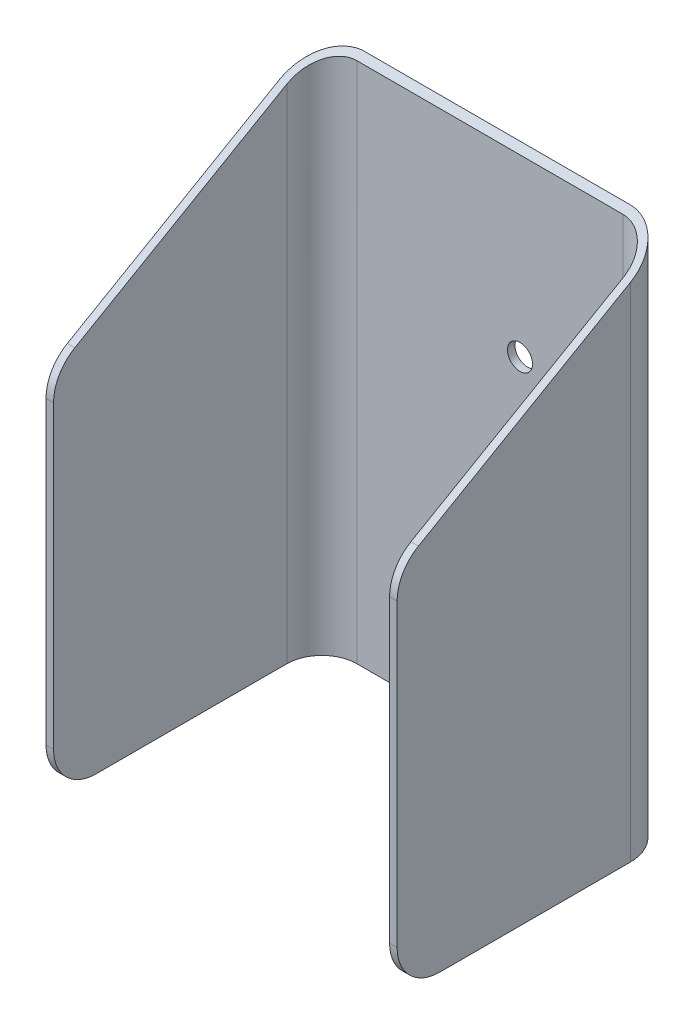
ISO-10303-21;
HEADER;
FILE_DESCRIPTION(('STEP AP214'),'2;1');
FILE_NAME('part.step','',(''),(''),'','','');
FILE_SCHEMA(('AUTOMOTIVE_DESIGN { 1 0 10303 214 1 1 1 1 }'));
ENDSEC;
DATA;
#1=APPLICATION_CONTEXT('core data for automotive mechanical design processes');
#2=APPLICATION_PROTOCOL_DEFINITION('international standard','automotive_design',2000,#1);
#3=PRODUCT_CONTEXT('',#1,'mechanical');
#4=PRODUCT('Part','Part','',(#3));
#5=PRODUCT_RELATED_PRODUCT_CATEGORY('part','',(#4));
#6=PRODUCT_DEFINITION_FORMATION('','',#4);
#7=PRODUCT_DEFINITION_CONTEXT('part definition',#1,'design');
#8=PRODUCT_DEFINITION('design','',#6,#7);
#9=PRODUCT_DEFINITION_SHAPE('','',#8);
#10=(LENGTH_UNIT() NAMED_UNIT(*) SI_UNIT(.MILLI.,.METRE.));
#11=(NAMED_UNIT(*) PLANE_ANGLE_UNIT() SI_UNIT($,.RADIAN.));
#12=(NAMED_UNIT(*) SI_UNIT($,.STERADIAN.) SOLID_ANGLE_UNIT());
#13=UNCERTAINTY_MEASURE_WITH_UNIT(LENGTH_MEASURE(1.E-05),#10,'distance_accuracy_value','');
#14=(GEOMETRIC_REPRESENTATION_CONTEXT(3) GLOBAL_UNCERTAINTY_ASSIGNED_CONTEXT((#13)) GLOBAL_UNIT_ASSIGNED_CONTEXT((#10,
#11,#12)) REPRESENTATION_CONTEXT('',''));
#15=CARTESIAN_POINT('',(0.,0.,0.));
#16=DIRECTION('',(0.,0.,1.));
#17=DIRECTION('',(1.,0.,0.));
#18=AXIS2_PLACEMENT_3D('',#15,#16,#17);
#19=CARTESIAN_POINT('',(1.5,0.,0.));
#20=DIRECTION('',(1.,0.,0.));
#21=DIRECTION('',(0.,0.,-1.));
#22=AXIS2_PLACEMENT_3D('',#19,#20,#21);
#23=PLANE('',#22);
#24=DIRECTION('',(0.,1.,0.));
#25=VECTOR('',#24,1.);
#26=CARTESIAN_POINT('',(1.5,0.,8.5));
#27=LINE('',#26,#25);
#28=CARTESIAN_POINT('',(1.5,100.092522711888,8.5));
#29=VERTEX_POINT('',#28);
#30=CARTESIAN_POINT('',(1.5,0.,8.5));
#31=VERTEX_POINT('',#30);
#32=EDGE_CURVE('E232',#29,#31,#27,.F.);
#33=ORIENTED_EDGE('',*,*,#32,.F.);
#34=DIRECTION('',(0.,0.500000000000004,-0.866025403784436));
#35=VECTOR('',#34,1.);
#36=CARTESIAN_POINT('',(1.5,105.,0.));
#37=LINE('',#36,#35);
#38=CARTESIAN_POINT('',(1.5,75.6994738386261,50.75));
#39=VERTEX_POINT('',#38);
#40=EDGE_CURVE('E254',#39,#29,#37,.T.);
#41=ORIENTED_EDGE('',*,*,#40,.F.);
#42=CARTESIAN_POINT('',(1.5,68.3382579064584,46.5));
#43=DIRECTION('',(-1.,0.,0.));
#44=DIRECTION('',(0.,0.,1.));
#45=AXIS2_PLACEMENT_3D('',#42,#43,#44);
#46=CIRCLE('',#45,8.5);
#47=CARTESIAN_POINT('',(1.5,68.3382579064584,55.));
#48=VERTEX_POINT('',#47);
#49=EDGE_CURVE('E11',#39,#48,#46,.F.);
#50=ORIENTED_EDGE('',*,*,#49,.T.);
#51=DIRECTION('',(0.,1.,0.));
#52=VECTOR('',#51,1.);
#53=CARTESIAN_POINT('',(1.5,73.2457351945702,55.));
#54=LINE('',#53,#52);
#55=CARTESIAN_POINT('',(1.5,8.49999999999999,55.));
#56=VERTEX_POINT('',#55);
#57=EDGE_CURVE('E234',#56,#48,#54,.T.);
#58=ORIENTED_EDGE('',*,*,#57,.F.);
#59=CARTESIAN_POINT('',(1.5,8.5,46.5));
#60=DIRECTION('',(-1.,0.,0.));
#61=DIRECTION('',(0.,0.,1.));
#62=AXIS2_PLACEMENT_3D('',#59,#60,#61);
#63=CIRCLE('',#62,8.5);
#64=CARTESIAN_POINT('',(1.5,0.,46.5));
#65=VERTEX_POINT('',#64);
#66=EDGE_CURVE('E258',#56,#65,#63,.F.);
#67=ORIENTED_EDGE('',*,*,#66,.T.);
#68=DIRECTION('',(0.,0.,1.));
#69=VECTOR('',#68,1.);
#70=CARTESIAN_POINT('',(1.5,0.,55.));
#71=LINE('',#70,#69);
#72=EDGE_CURVE('E158',#31,#65,#71,.T.);
#73=ORIENTED_EDGE('',*,*,#72,.F.);
#74=EDGE_LOOP('',(#33,#41,#50,#58,#67,#73));
#75=FACE_BOUND('',#74,.T.);
#76=ADVANCED_FACE('F33',(#75),#23,.T.);
#77=CARTESIAN_POINT('',(8.5,0.,8.5));
#78=DIRECTION('',(0.,1.,0.));
#79=DIRECTION('',(0.,0.,1.));
#80=AXIS2_PLACEMENT_3D('',#77,#78,#79);
#81=CYLINDRICAL_SURFACE('',#80,7.);
#82=ORIENTED_EDGE('',*,*,#32,.T.);
#83=CARTESIAN_POINT('',(8.5,0.,8.5));
#84=DIRECTION('',(0.,1.,0.));
#85=DIRECTION('',(0.,0.,1.));
#86=AXIS2_PLACEMENT_3D('',#83,#84,#85);
#87=CIRCLE('',#86,7.);
#88=CARTESIAN_POINT('',(8.5,0.,1.5));
#89=VERTEX_POINT('',#88);
#90=EDGE_CURVE('E241',#89,#31,#87,.T.);
#91=ORIENTED_EDGE('',*,*,#90,.F.);
#92=DIRECTION('',(0.,1.,0.));
#93=VECTOR('',#92,1.);
#94=CARTESIAN_POINT('',(8.5,0.,1.5));
#95=LINE('',#94,#93);
#96=CARTESIAN_POINT('',(8.5,104.133974596216,1.5));
#97=VERTEX_POINT('',#96);
#98=EDGE_CURVE('E237',#89,#97,#95,.T.);
#99=ORIENTED_EDGE('',*,*,#98,.T.);
#100=CARTESIAN_POINT('',(8.5,100.092522711888,8.5));
#101=DIRECTION('',(0.,-0.866025403784436,-0.500000000000004));
#102=DIRECTION('',(0.,-0.500000000000004,0.866025403784436));
#103=AXIS2_PLACEMENT_3D('',#100,#101,#102);
#104=ELLIPSE('',#103,8.08290376865478,7.);
#105=EDGE_CURVE('E257',#29,#97,#104,.T.);
#106=ORIENTED_EDGE('',*,*,#105,.F.);
#107=EDGE_LOOP('',(#82,#91,#99,#106));
#108=FACE_BOUND('',#107,.T.);
#109=ADVANCED_FACE('F35',(#108),#81,.F.);
#110=CARTESIAN_POINT('',(70.,0.,1.5));
#111=DIRECTION('',(0.,0.,1.));
#112=DIRECTION('',(1.,0.,0.));
#113=AXIS2_PLACEMENT_3D('',#110,#111,#112);
#114=PLANE('',#113);
#115=CARTESIAN_POINT('',(41.,54.2360214657054,1.5));
#116=DIRECTION('',(0.,0.,1.));
#117=DIRECTION('',(1.,0.,0.));
#118=AXIS2_PLACEMENT_3D('',#115,#116,#117);
#119=CIRCLE('',#118,2.5);
#120=CARTESIAN_POINT('',(43.5,54.2360214657054,1.5));
#121=VERTEX_POINT('',#120);
#122=EDGE_CURVE('E297',#121,#121,#119,.F.);
#123=ORIENTED_EDGE('',*,*,#122,.T.);
#124=EDGE_LOOP('',(#123));
#125=FACE_BOUND('',#124,.T.);
#126=CARTESIAN_POINT('',(41.,69.2360214657054,1.5));
#127=DIRECTION('',(0.,0.,1.));
#128=DIRECTION('',(1.,0.,0.));
#129=AXIS2_PLACEMENT_3D('',#126,#127,#128);
#130=CIRCLE('',#129,2.50000000000001);
#131=CARTESIAN_POINT('',(43.5,69.2360214657054,1.5));
#132=VERTEX_POINT('',#131);
#133=EDGE_CURVE('E187',#132,#132,#130,.F.);
#134=ORIENTED_EDGE('',*,*,#133,.T.);
#135=EDGE_LOOP('',(#134));
#136=FACE_BOUND('',#135,.T.);
#137=DIRECTION('',(0.,1.,0.));
#138=VECTOR('',#137,1.);
#139=CARTESIAN_POINT('',(61.5,0.,1.5));
#140=LINE('',#139,#138);
#141=CARTESIAN_POINT('',(61.5,104.133974596216,1.5));
#142=VERTEX_POINT('',#141);
#143=CARTESIAN_POINT('',(61.5,0.,1.5));
#144=VERTEX_POINT('',#143);
#145=EDGE_CURVE('E231',#142,#144,#140,.F.);
#146=ORIENTED_EDGE('',*,*,#145,.F.);
#147=DIRECTION('',(1.,0.,0.));
#148=VECTOR('',#147,1.);
#149=CARTESIAN_POINT('',(70.,104.133974596216,1.5));
#150=LINE('',#149,#148);
#151=EDGE_CURVE('E262',#97,#142,#150,.T.);
#152=ORIENTED_EDGE('',*,*,#151,.F.);
#153=ORIENTED_EDGE('',*,*,#98,.F.);
#154=DIRECTION('',(-1.,0.,0.));
#155=VECTOR('',#154,1.);
#156=CARTESIAN_POINT('',(70.,0.,1.5));
#157=LINE('',#156,#155);
#158=EDGE_CURVE('E243',#144,#89,#157,.T.);
#159=ORIENTED_EDGE('',*,*,#158,.F.);
#160=EDGE_LOOP('',(#146,#152,#153,#159));
#161=FACE_BOUND('',#160,.T.);
#162=ADVANCED_FACE('F328',(#125,#136,#161),#114,.T.);
#163=CARTESIAN_POINT('',(61.5,0.,8.5));
#164=DIRECTION('',(0.,-1.,0.));
#165=DIRECTION('',(0.,0.,-1.));
#166=AXIS2_PLACEMENT_3D('',#163,#164,#165);
#167=CYLINDRICAL_SURFACE('',#166,7.);
#168=ORIENTED_EDGE('',*,*,#145,.T.);
#169=CARTESIAN_POINT('',(61.5,0.,8.5));
#170=DIRECTION('',(0.,1.,0.));
#171=DIRECTION('',(0.,0.,1.));
#172=AXIS2_PLACEMENT_3D('',#169,#170,#171);
#173=CIRCLE('',#172,7.);
#174=CARTESIAN_POINT('',(68.5,0.,8.5));
#175=VERTEX_POINT('',#174);
#176=EDGE_CURVE('E246',#175,#144,#173,.T.);
#177=ORIENTED_EDGE('',*,*,#176,.F.);
#178=DIRECTION('',(0.,1.,0.));
#179=VECTOR('',#178,1.);
#180=CARTESIAN_POINT('',(68.5,0.,8.5));
#181=LINE('',#180,#179);
#182=CARTESIAN_POINT('',(68.5,100.092522711888,8.5));
#183=VERTEX_POINT('',#182);
#184=EDGE_CURVE('E235',#175,#183,#181,.T.);
#185=ORIENTED_EDGE('',*,*,#184,.T.);
#186=CARTESIAN_POINT('',(61.5,100.092522711888,8.5));
#187=DIRECTION('',(0.,-0.866025403784436,-0.500000000000004));
#188=DIRECTION('',(0.,-0.500000000000004,0.866025403784436));
#189=AXIS2_PLACEMENT_3D('',#186,#187,#188);
#190=ELLIPSE('',#189,8.08290376865478,7.);
#191=EDGE_CURVE('E265',#142,#183,#190,.T.);
#192=ORIENTED_EDGE('',*,*,#191,.F.);
#193=EDGE_LOOP('',(#168,#177,#185,#192));
#194=FACE_BOUND('',#193,.T.);
#195=ADVANCED_FACE('F325',(#194),#167,.F.);
#196=CARTESIAN_POINT('',(68.5,0.,0.));
#197=DIRECTION('',(1.,0.,0.));
#198=DIRECTION('',(0.,0.,-1.));
#199=AXIS2_PLACEMENT_3D('',#196,#197,#198);
#200=PLANE('',#199);
#201=ORIENTED_EDGE('',*,*,#184,.F.);
#202=DIRECTION('',(0.,0.,-1.));
#203=VECTOR('',#202,1.);
#204=CARTESIAN_POINT('',(68.5,0.,55.));
#205=LINE('',#204,#203);
#206=CARTESIAN_POINT('',(68.5,0.,46.5));
#207=VERTEX_POINT('',#206);
#208=EDGE_CURVE('E249',#207,#175,#205,.T.);
#209=ORIENTED_EDGE('',*,*,#208,.F.);
#210=CARTESIAN_POINT('',(68.5,8.5,46.5));
#211=DIRECTION('',(1.,0.,0.));
#212=DIRECTION('',(0.,0.,-1.));
#213=AXIS2_PLACEMENT_3D('',#210,#211,#212);
#214=CIRCLE('',#213,8.5);
#215=CARTESIAN_POINT('',(68.5,8.49999999999999,55.));
#216=VERTEX_POINT('',#215);
#217=EDGE_CURVE('E37',#207,#216,#214,.F.);
#218=ORIENTED_EDGE('',*,*,#217,.T.);
#219=DIRECTION('',(0.,-1.,0.));
#220=VECTOR('',#219,1.);
#221=CARTESIAN_POINT('',(68.5,73.2457351945702,55.));
#222=LINE('',#221,#220);
#223=CARTESIAN_POINT('',(68.5,68.3382579064584,55.));
#224=VERTEX_POINT('',#223);
#225=EDGE_CURVE('E253',#224,#216,#222,.T.);
#226=ORIENTED_EDGE('',*,*,#225,.F.);
#227=CARTESIAN_POINT('',(68.5,68.3382579064584,46.5));
#228=DIRECTION('',(1.,0.,0.));
#229=DIRECTION('',(0.,0.,-1.));
#230=AXIS2_PLACEMENT_3D('',#227,#228,#229);
#231=CIRCLE('',#230,8.5);
#232=CARTESIAN_POINT('',(68.5,75.6994738386261,50.75));
#233=VERTEX_POINT('',#232);
#234=EDGE_CURVE('E42',#224,#233,#231,.F.);
#235=ORIENTED_EDGE('',*,*,#234,.T.);
#236=DIRECTION('',(0.,-0.500000000000004,0.866025403784436));
#237=VECTOR('',#236,1.);
#238=CARTESIAN_POINT('',(68.5,105.,0.));
#239=LINE('',#238,#237);
#240=EDGE_CURVE('E56',#183,#233,#239,.T.);
#241=ORIENTED_EDGE('',*,*,#240,.F.);
#242=EDGE_LOOP('',(#201,#209,#218,#226,#235,#241));
#243=FACE_BOUND('',#242,.T.);
#244=ADVANCED_FACE('F278',(#243),#200,.F.);
#245=CARTESIAN_POINT('',(70.,73.2457351945702,55.));
#246=DIRECTION('',(0.,0.,-1.));
#247=DIRECTION('',(0.,1.,0.));
#248=AXIS2_PLACEMENT_3D('',#245,#246,#247);
#249=PLANE('',#248);
#250=DIRECTION('',(-1.,0.,0.));
#251=VECTOR('',#250,1.);
#252=CARTESIAN_POINT('',(70.,68.3382579064584,55.));
#253=LINE('',#252,#251);
#254=CARTESIAN_POINT('',(70.,68.3382579064584,55.));
#255=VERTEX_POINT('',#254);
#256=EDGE_CURVE('E206',#255,#224,#253,.T.);
#257=ORIENTED_EDGE('',*,*,#256,.T.);
#258=ORIENTED_EDGE('',*,*,#225,.T.);
#259=DIRECTION('',(-1.,0.,0.));
#260=VECTOR('',#259,1.);
#261=CARTESIAN_POINT('',(70.,8.49999999999999,55.));
#262=LINE('',#261,#260);
#263=CARTESIAN_POINT('',(70.,8.49999999999999,55.));
#264=VERTEX_POINT('',#263);
#265=EDGE_CURVE('E209',#216,#264,#262,.F.);
#266=ORIENTED_EDGE('',*,*,#265,.T.);
#267=DIRECTION('',(0.,-1.,0.));
#268=VECTOR('',#267,1.);
#269=CARTESIAN_POINT('',(70.,73.2457351945702,55.));
#270=LINE('',#269,#268);
#271=EDGE_CURVE('E190',#255,#264,#270,.T.);
#272=ORIENTED_EDGE('',*,*,#271,.F.);
#273=EDGE_LOOP('',(#257,#258,#266,#272));
#274=FACE_BOUND('',#273,.T.);
#275=ADVANCED_FACE('F271',(#274),#249,.F.);
#276=CARTESIAN_POINT('',(70.,8.5,46.5));
#277=DIRECTION('',(-1.,0.,0.));
#278=DIRECTION('',(0.,0.,1.));
#279=AXIS2_PLACEMENT_3D('',#276,#277,#278);
#280=CYLINDRICAL_SURFACE('',#279,8.5);
#281=ORIENTED_EDGE('',*,*,#217,.F.);
#282=DIRECTION('',(-1.,0.,0.));
#283=VECTOR('',#282,1.);
#284=CARTESIAN_POINT('',(70.,0.,46.5));
#285=LINE('',#284,#283);
#286=CARTESIAN_POINT('',(70.,0.,46.5));
#287=VERTEX_POINT('',#286);
#288=EDGE_CURVE('E162',#287,#207,#285,.T.);
#289=ORIENTED_EDGE('',*,*,#288,.F.);
#290=CARTESIAN_POINT('',(70.,8.5,46.5));
#291=DIRECTION('',(1.,0.,0.));
#292=DIRECTION('',(0.,0.,-1.));
#293=AXIS2_PLACEMENT_3D('',#290,#291,#292);
#294=CIRCLE('',#293,8.5);
#295=EDGE_CURVE('E216',#264,#287,#294,.T.);
#296=ORIENTED_EDGE('',*,*,#295,.F.);
#297=ORIENTED_EDGE('',*,*,#265,.F.);
#298=EDGE_LOOP('',(#281,#289,#296,#297));
#299=FACE_BOUND('',#298,.T.);
#300=ADVANCED_FACE('F282',(#299),#280,.T.);
#301=CARTESIAN_POINT('',(70.,68.3382579064584,46.5));
#302=DIRECTION('',(-1.,0.,0.));
#303=DIRECTION('',(0.,0.,1.));
#304=AXIS2_PLACEMENT_3D('',#301,#302,#303);
#305=CYLINDRICAL_SURFACE('',#304,8.5);
#306=ORIENTED_EDGE('',*,*,#234,.F.);
#307=ORIENTED_EDGE('',*,*,#256,.F.);
#308=CARTESIAN_POINT('',(70.,68.3382579064584,46.5));
#309=DIRECTION('',(1.,0.,0.));
#310=DIRECTION('',(0.,0.,-1.));
#311=AXIS2_PLACEMENT_3D('',#308,#309,#310);
#312=CIRCLE('',#311,8.5);
#313=CARTESIAN_POINT('',(70.,75.6994738386261,50.75));
#314=VERTEX_POINT('',#313);
#315=EDGE_CURVE('E214',#314,#255,#312,.T.);
#316=ORIENTED_EDGE('',*,*,#315,.F.);
#317=DIRECTION('',(-1.,0.,0.));
#318=VECTOR('',#317,1.);
#319=CARTESIAN_POINT('',(70.,75.6994738386261,50.75));
#320=LINE('',#319,#318);
#321=EDGE_CURVE('E222',#233,#314,#320,.F.);
#322=ORIENTED_EDGE('',*,*,#321,.F.);
#323=EDGE_LOOP('',(#306,#307,#316,#322));
#324=FACE_BOUND('',#323,.T.);
#325=ADVANCED_FACE('F321',(#324),#305,.T.);
#326=CARTESIAN_POINT('',(70.,0.,55.));
#327=DIRECTION('',(0.,1.,0.));
#328=DIRECTION('',(0.,0.,1.));
#329=AXIS2_PLACEMENT_3D('',#326,#327,#328);
#330=PLANE('',#329);
#331=ORIENTED_EDGE('',*,*,#288,.T.);
#332=ORIENTED_EDGE('',*,*,#208,.T.);
#333=ORIENTED_EDGE('',*,*,#176,.T.);
#334=ORIENTED_EDGE('',*,*,#158,.T.);
#335=ORIENTED_EDGE('',*,*,#90,.T.);
#336=ORIENTED_EDGE('',*,*,#72,.T.);
#337=CARTESIAN_POINT('',(0.,0.,46.5));
#338=VERTEX_POINT('',#337);
#339=EDGE_CURVE('E149',#65,#338,#285,.T.);
#340=ORIENTED_EDGE('',*,*,#339,.T.);
#341=DIRECTION('',(0.,0.,-1.));
#342=VECTOR('',#341,1.);
#343=CARTESIAN_POINT('',(0.,0.,55.));
#344=LINE('',#343,#342);
#345=CARTESIAN_POINT('',(0.,0.,8.5));
#346=VERTEX_POINT('',#345);
#347=EDGE_CURVE('E154',#338,#346,#344,.T.);
#348=ORIENTED_EDGE('',*,*,#347,.T.);
#349=CARTESIAN_POINT('',(8.5,0.,8.5));
#350=DIRECTION('',(0.,1.,0.));
#351=DIRECTION('',(0.,0.,1.));
#352=AXIS2_PLACEMENT_3D('',#349,#350,#351);
#353=CIRCLE('',#352,8.5);
#354=CARTESIAN_POINT('',(8.5,0.,0.));
#355=VERTEX_POINT('',#354);
#356=EDGE_CURVE('E201',#346,#355,#353,.F.);
#357=ORIENTED_EDGE('',*,*,#356,.T.);
#358=DIRECTION('',(-1.,0.,0.));
#359=VECTOR('',#358,1.);
#360=CARTESIAN_POINT('',(70.,0.,0.));
#361=LINE('',#360,#359);
#362=CARTESIAN_POINT('',(61.5,0.,0.));
#363=VERTEX_POINT('',#362);
#364=EDGE_CURVE('E198',#363,#355,#361,.T.);
#365=ORIENTED_EDGE('',*,*,#364,.F.);
#366=CARTESIAN_POINT('',(61.5,0.,8.5));
#367=DIRECTION('',(0.,1.,0.));
#368=DIRECTION('',(0.,0.,1.));
#369=AXIS2_PLACEMENT_3D('',#366,#367,#368);
#370=CIRCLE('',#369,8.5);
#371=CARTESIAN_POINT('',(70.,0.,8.5));
#372=VERTEX_POINT('',#371);
#373=EDGE_CURVE('E163',#363,#372,#370,.F.);
#374=ORIENTED_EDGE('',*,*,#373,.T.);
#375=DIRECTION('',(0.,0.,-1.));
#376=VECTOR('',#375,1.);
#377=CARTESIAN_POINT('',(70.,0.,55.));
#378=LINE('',#377,#376);
#379=EDGE_CURVE('E194',#287,#372,#378,.T.);
#380=ORIENTED_EDGE('',*,*,#379,.F.);
#381=EDGE_LOOP('',(#331,#332,#333,#334,#335,#336,#340,#348,#357,#365,#374,#380));
#382=FACE_BOUND('',#381,.T.);
#383=ADVANCED_FACE('F152',(#382),#330,.F.);
#384=CARTESIAN_POINT('',(70.,0.,0.));
#385=DIRECTION('',(0.,0.,1.));
#386=DIRECTION('',(1.,0.,0.));
#387=AXIS2_PLACEMENT_3D('',#384,#385,#386);
#388=PLANE('',#387);
#389=CARTESIAN_POINT('',(41.,54.2360214657054,0.));
#390=DIRECTION('',(0.,0.,-1.));
#391=DIRECTION('',(-1.,0.,0.));
#392=AXIS2_PLACEMENT_3D('',#389,#390,#391);
#393=CIRCLE('',#392,2.5);
#394=CARTESIAN_POINT('',(38.5,54.2360214657054,0.));
#395=VERTEX_POINT('',#394);
#396=EDGE_CURVE('E295',#395,#395,#393,.T.);
#397=ORIENTED_EDGE('',*,*,#396,.F.);
#398=EDGE_LOOP('',(#397));
#399=FACE_BOUND('',#398,.T.);
#400=CARTESIAN_POINT('',(41.,69.2360214657054,0.));
#401=DIRECTION('',(0.,0.,-1.));
#402=DIRECTION('',(-1.,0.,0.));
#403=AXIS2_PLACEMENT_3D('',#400,#401,#402);
#404=CIRCLE('',#403,2.50000000000001);
#405=CARTESIAN_POINT('',(38.5,69.2360214657054,0.));
#406=VERTEX_POINT('',#405);
#407=EDGE_CURVE('E181',#406,#406,#404,.T.);
#408=ORIENTED_EDGE('',*,*,#407,.F.);
#409=EDGE_LOOP('',(#408));
#410=FACE_BOUND('',#409,.T.);
#411=DIRECTION('',(-1.,0.,0.));
#412=VECTOR('',#411,1.);
#413=CARTESIAN_POINT('',(70.,105.,0.));
#414=LINE('',#413,#412);
#415=CARTESIAN_POINT('',(61.5,105.,0.));
#416=VERTEX_POINT('',#415);
#417=CARTESIAN_POINT('',(8.5,105.,0.));
#418=VERTEX_POINT('',#417);
#419=EDGE_CURVE('E195',#416,#418,#414,.T.);
#420=ORIENTED_EDGE('',*,*,#419,.F.);
#421=DIRECTION('',(0.,1.,0.));
#422=VECTOR('',#421,1.);
#423=CARTESIAN_POINT('',(61.5,0.,0.));
#424=LINE('',#423,#422);
#425=EDGE_CURVE('E229',#416,#363,#424,.F.);
#426=ORIENTED_EDGE('',*,*,#425,.T.);
#427=ORIENTED_EDGE('',*,*,#364,.T.);
#428=DIRECTION('',(0.,1.,0.));
#429=VECTOR('',#428,1.);
#430=CARTESIAN_POINT('',(8.5,0.,0.));
#431=LINE('',#430,#429);
#432=EDGE_CURVE('E226',#355,#418,#431,.T.);
#433=ORIENTED_EDGE('',*,*,#432,.T.);
#434=EDGE_LOOP('',(#420,#426,#427,#433));
#435=FACE_BOUND('',#434,.T.);
#436=ADVANCED_FACE('F305',(#399,#410,#435),#388,.F.);
#437=CARTESIAN_POINT('',(70.,105.,0.));
#438=DIRECTION('',(0.,-0.866025403784436,-0.500000000000004));
#439=DIRECTION('',(0.,0.500000000000004,-0.866025403784436));
#440=AXIS2_PLACEMENT_3D('',#437,#438,#439);
#441=PLANE('',#440);
#442=ORIENTED_EDGE('',*,*,#191,.T.);
#443=ORIENTED_EDGE('',*,*,#240,.T.);
#444=ORIENTED_EDGE('',*,*,#321,.T.);
#445=DIRECTION('',(0.,-0.500000000000004,0.866025403784436));
#446=VECTOR('',#445,1.);
#447=CARTESIAN_POINT('',(70.,105.,0.));
#448=LINE('',#447,#446);
#449=CARTESIAN_POINT('',(70.,100.092522711888,8.5));
#450=VERTEX_POINT('',#449);
#451=EDGE_CURVE('E290',#450,#314,#448,.T.);
#452=ORIENTED_EDGE('',*,*,#451,.F.);
#453=CARTESIAN_POINT('',(61.5,100.092522711888,8.5));
#454=DIRECTION('',(0.,-0.866025403784436,-0.500000000000004));
#455=DIRECTION('',(0.,-0.500000000000004,0.866025403784436));
#456=AXIS2_PLACEMENT_3D('',#453,#454,#455);
#457=ELLIPSE('',#456,9.81495457622366,8.5);
#458=EDGE_CURVE('E220',#450,#416,#457,.F.);
#459=ORIENTED_EDGE('',*,*,#458,.T.);
#460=ORIENTED_EDGE('',*,*,#419,.T.);
#461=CARTESIAN_POINT('',(8.5,100.092522711888,8.5));
#462=DIRECTION('',(0.,-0.866025403784436,-0.500000000000004));
#463=DIRECTION('',(0.,0.500000000000004,-0.866025403784436));
#464=AXIS2_PLACEMENT_3D('',#461,#462,#463);
#465=ELLIPSE('',#464,9.81495457622366,8.5);
#466=CARTESIAN_POINT('',(0.,100.092522711888,8.5));
#467=VERTEX_POINT('',#466);
#468=EDGE_CURVE('E218',#418,#467,#465,.F.);
#469=ORIENTED_EDGE('',*,*,#468,.T.);
#470=DIRECTION('',(0.,-0.500000000000004,0.866025403784436));
#471=VECTOR('',#470,1.);
#472=CARTESIAN_POINT('',(0.,105.,0.));
#473=LINE('',#472,#471);
#474=CARTESIAN_POINT('',(0.,75.6994738386261,50.75));
#475=VERTEX_POINT('',#474);
#476=EDGE_CURVE('E180',#467,#475,#473,.T.);
#477=ORIENTED_EDGE('',*,*,#476,.T.);
#478=EDGE_CURVE('E223',#475,#39,#320,.F.);
#479=ORIENTED_EDGE('',*,*,#478,.T.);
#480=ORIENTED_EDGE('',*,*,#40,.T.);
#481=ORIENTED_EDGE('',*,*,#105,.T.);
#482=ORIENTED_EDGE('',*,*,#151,.T.);
#483=EDGE_LOOP('',(#442,#443,#444,#452,#459,#460,#469,#477,#479,#480,#481,#482));
#484=FACE_BOUND('',#483,.T.);
#485=ADVANCED_FACE('F308',(#484),#441,.F.);
#486=CARTESIAN_POINT('',(0.,8.49999999999999,55.));
#487=VERTEX_POINT('',#486);
#488=EDGE_CURVE('E169',#487,#56,#262,.F.);
#489=ORIENTED_EDGE('',*,*,#488,.T.);
#490=ORIENTED_EDGE('',*,*,#57,.T.);
#491=CARTESIAN_POINT('',(0.,68.3382579064584,55.));
#492=VERTEX_POINT('',#491);
#493=EDGE_CURVE('E173',#48,#492,#253,.T.);
#494=ORIENTED_EDGE('',*,*,#493,.T.);
#495=DIRECTION('',(0.,-1.,0.));
#496=VECTOR('',#495,1.);
#497=CARTESIAN_POINT('',(0.,73.2457351945702,55.));
#498=LINE('',#497,#496);
#499=EDGE_CURVE('E184',#492,#487,#498,.T.);
#500=ORIENTED_EDGE('',*,*,#499,.T.);
#501=EDGE_LOOP('',(#489,#490,#494,#500));
#502=FACE_BOUND('',#501,.T.);
#503=ADVANCED_FACE('F335',(#502),#249,.F.);
#504=CARTESIAN_POINT('',(70.,0.,0.));
#505=DIRECTION('',(1.,0.,0.));
#506=DIRECTION('',(0.,0.,-1.));
#507=AXIS2_PLACEMENT_3D('',#504,#505,#506);
#508=PLANE('',#507);
#509=ORIENTED_EDGE('',*,*,#271,.T.);
#510=ORIENTED_EDGE('',*,*,#295,.T.);
#511=ORIENTED_EDGE('',*,*,#379,.T.);
#512=DIRECTION('',(0.,1.,0.));
#513=VECTOR('',#512,1.);
#514=CARTESIAN_POINT('',(70.,105.,8.5));
#515=LINE('',#514,#513);
#516=EDGE_CURVE('E211',#372,#450,#515,.T.);
#517=ORIENTED_EDGE('',*,*,#516,.T.);
#518=ORIENTED_EDGE('',*,*,#451,.T.);
#519=ORIENTED_EDGE('',*,*,#315,.T.);
#520=EDGE_LOOP('',(#509,#510,#511,#517,#518,#519));
#521=FACE_BOUND('',#520,.T.);
#522=ADVANCED_FACE('F286',(#521),#508,.T.);
#523=CARTESIAN_POINT('',(0.,0.,0.));
#524=DIRECTION('',(1.,0.,0.));
#525=DIRECTION('',(0.,0.,-1.));
#526=AXIS2_PLACEMENT_3D('',#523,#524,#525);
#527=PLANE('',#526);
#528=ORIENTED_EDGE('',*,*,#347,.F.);
#529=CARTESIAN_POINT('',(0.,8.5,46.5));
#530=DIRECTION('',(1.,0.,0.));
#531=DIRECTION('',(0.,0.,-1.));
#532=AXIS2_PLACEMENT_3D('',#529,#530,#531);
#533=CIRCLE('',#532,8.5);
#534=EDGE_CURVE('E166',#338,#487,#533,.F.);
#535=ORIENTED_EDGE('',*,*,#534,.T.);
#536=ORIENTED_EDGE('',*,*,#499,.F.);
#537=CARTESIAN_POINT('',(0.,68.3382579064584,46.5));
#538=DIRECTION('',(1.,0.,0.));
#539=DIRECTION('',(0.,0.,-1.));
#540=AXIS2_PLACEMENT_3D('',#537,#538,#539);
#541=CIRCLE('',#540,8.5);
#542=EDGE_CURVE('E174',#492,#475,#541,.F.);
#543=ORIENTED_EDGE('',*,*,#542,.T.);
#544=ORIENTED_EDGE('',*,*,#476,.F.);
#545=DIRECTION('',(0.,1.,0.));
#546=VECTOR('',#545,1.);
#547=CARTESIAN_POINT('',(0.,0.,8.5));
#548=LINE('',#547,#546);
#549=EDGE_CURVE('E179',#467,#346,#548,.F.);
#550=ORIENTED_EDGE('',*,*,#549,.T.);
#551=EDGE_LOOP('',(#528,#535,#536,#543,#544,#550));
#552=FACE_BOUND('',#551,.T.);
#553=ADVANCED_FACE('F176',(#552),#527,.F.);
#554=ORIENTED_EDGE('',*,*,#66,.F.);
#555=ORIENTED_EDGE('',*,*,#488,.F.);
#556=ORIENTED_EDGE('',*,*,#534,.F.);
#557=ORIENTED_EDGE('',*,*,#339,.F.);
#558=EDGE_LOOP('',(#554,#555,#556,#557));
#559=FACE_BOUND('',#558,.T.);
#560=ADVANCED_FACE('F167',(#559),#280,.T.);
#561=ORIENTED_EDGE('',*,*,#49,.F.);
#562=ORIENTED_EDGE('',*,*,#478,.F.);
#563=ORIENTED_EDGE('',*,*,#542,.F.);
#564=ORIENTED_EDGE('',*,*,#493,.F.);
#565=EDGE_LOOP('',(#561,#562,#563,#564));
#566=FACE_BOUND('',#565,.T.);
#567=ADVANCED_FACE('F337',(#566),#305,.T.);
#568=CARTESIAN_POINT('',(61.5,0.,8.5));
#569=DIRECTION('',(0.,-1.,0.));
#570=DIRECTION('',(0.,0.,-1.));
#571=AXIS2_PLACEMENT_3D('',#568,#569,#570);
#572=CYLINDRICAL_SURFACE('',#571,8.5);
#573=ORIENTED_EDGE('',*,*,#373,.F.);
#574=ORIENTED_EDGE('',*,*,#425,.F.);
#575=ORIENTED_EDGE('',*,*,#458,.F.);
#576=ORIENTED_EDGE('',*,*,#516,.F.);
#577=EDGE_LOOP('',(#573,#574,#575,#576));
#578=FACE_BOUND('',#577,.T.);
#579=ADVANCED_FACE('F316',(#578),#572,.T.);
#580=CARTESIAN_POINT('',(8.5,0.,8.5));
#581=DIRECTION('',(0.,1.,0.));
#582=DIRECTION('',(0.,0.,1.));
#583=AXIS2_PLACEMENT_3D('',#580,#581,#582);
#584=CYLINDRICAL_SURFACE('',#583,8.5);
#585=ORIENTED_EDGE('',*,*,#356,.F.);
#586=ORIENTED_EDGE('',*,*,#549,.F.);
#587=ORIENTED_EDGE('',*,*,#468,.F.);
#588=ORIENTED_EDGE('',*,*,#432,.F.);
#589=EDGE_LOOP('',(#585,#586,#587,#588));
#590=FACE_BOUND('',#589,.T.);
#591=ADVANCED_FACE('F344',(#590),#584,.T.);
#592=CARTESIAN_POINT('',(41.,69.2360214657054,55.001));
#593=DIRECTION('',(0.,0.,-1.));
#594=DIRECTION('',(-1.,0.,0.));
#595=AXIS2_PLACEMENT_3D('',#592,#593,#594);
#596=CYLINDRICAL_SURFACE('',#595,2.50000000000001);
#597=ORIENTED_EDGE('',*,*,#133,.F.);
#598=EDGE_LOOP('',(#597));
#599=FACE_BOUND('',#598,.T.);
#600=ORIENTED_EDGE('',*,*,#407,.T.);
#601=EDGE_LOOP('',(#600));
#602=FACE_BOUND('',#601,.T.);
#603=ADVANCED_FACE('F349',(#599,#602),#596,.F.);
#604=CARTESIAN_POINT('',(41.,54.2360214657054,55.001));
#605=DIRECTION('',(0.,0.,-1.));
#606=DIRECTION('',(-1.,0.,0.));
#607=AXIS2_PLACEMENT_3D('',#604,#605,#606);
#608=CYLINDRICAL_SURFACE('',#607,2.5);
#609=ORIENTED_EDGE('',*,*,#122,.F.);
#610=EDGE_LOOP('',(#609));
#611=FACE_BOUND('',#610,.T.);
#612=ORIENTED_EDGE('',*,*,#396,.T.);
#613=EDGE_LOOP('',(#612));
#614=FACE_BOUND('',#613,.T.);
#615=ADVANCED_FACE('F303',(#611,#614),#608,.F.);
#616=CLOSED_SHELL('',(#76,#109,#162,#195,#244,#275,#300,#325,#383,#436,#485,#503,#522,#553,#560,
#567,#579,#591,#603,#615));
#617=MANIFOLD_SOLID_BREP('B2',#616);
#618=ADVANCED_BREP_SHAPE_REPRESENTATION('',(#18,#617),#14);
#619=SHAPE_DEFINITION_REPRESENTATION(#9,#618);
ENDSEC;
END-ISO-10303-21;
